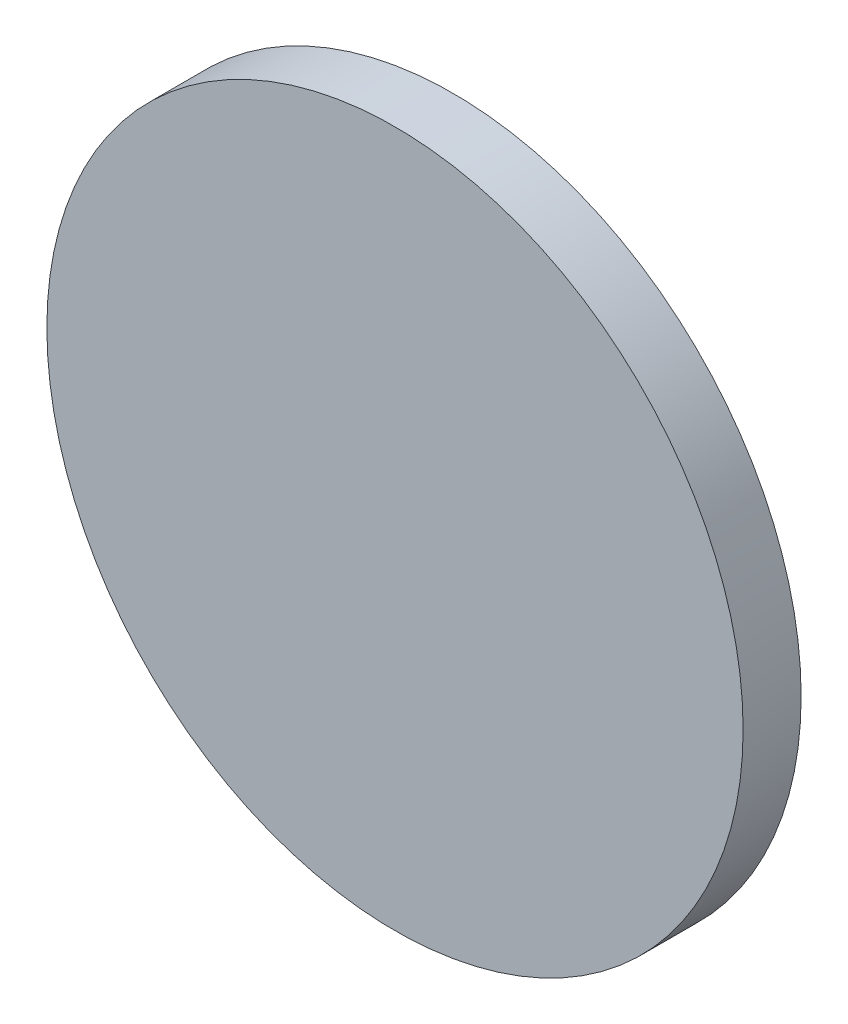
ISO-10303-21;
HEADER;
FILE_DESCRIPTION(('STEP AP214'),'2;1');
FILE_NAME('part.step','',(''),(''),'','','');
FILE_SCHEMA(('AUTOMOTIVE_DESIGN { 1 0 10303 214 1 1 1 1 }'));
ENDSEC;
DATA;
#1=APPLICATION_CONTEXT('core data for automotive mechanical design processes');
#2=APPLICATION_PROTOCOL_DEFINITION('international standard','automotive_design',2000,#1);
#3=PRODUCT_CONTEXT('',#1,'mechanical');
#4=PRODUCT('Part','Part','',(#3));
#5=PRODUCT_RELATED_PRODUCT_CATEGORY('part','',(#4));
#6=PRODUCT_DEFINITION_FORMATION('','',#4);
#7=PRODUCT_DEFINITION_CONTEXT('part definition',#1,'design');
#8=PRODUCT_DEFINITION('design','',#6,#7);
#9=PRODUCT_DEFINITION_SHAPE('','',#8);
#10=(LENGTH_UNIT() NAMED_UNIT(*) SI_UNIT(.MILLI.,.METRE.));
#11=(NAMED_UNIT(*) PLANE_ANGLE_UNIT() SI_UNIT($,.RADIAN.));
#12=(NAMED_UNIT(*) SI_UNIT($,.STERADIAN.) SOLID_ANGLE_UNIT());
#13=UNCERTAINTY_MEASURE_WITH_UNIT(LENGTH_MEASURE(1.E-05),#10,'distance_accuracy_value','');
#14=(GEOMETRIC_REPRESENTATION_CONTEXT(3) GLOBAL_UNCERTAINTY_ASSIGNED_CONTEXT((#13)) GLOBAL_UNIT_ASSIGNED_CONTEXT((#10,
#11,#12)) REPRESENTATION_CONTEXT('',''));
#15=CARTESIAN_POINT('',(0.,0.,0.));
#16=DIRECTION('',(0.,0.,1.));
#17=DIRECTION('',(1.,0.,0.));
#18=AXIS2_PLACEMENT_3D('',#15,#16,#17);
#19=CARTESIAN_POINT('',(0.,0.,12.7));
#20=DIRECTION('',(0.,0.,-1.));
#21=DIRECTION('',(-1.,0.,0.));
#22=AXIS2_PLACEMENT_3D('',#19,#20,#21);
#23=CYLINDRICAL_SURFACE('',#22,76.2);
#24=CARTESIAN_POINT('',(0.,0.,12.7));
#25=DIRECTION('',(0.,0.,1.));
#26=DIRECTION('',(1.,0.,0.));
#27=AXIS2_PLACEMENT_3D('',#24,#25,#26);
#28=CIRCLE('',#27,76.2);
#29=CARTESIAN_POINT('',(76.2,0.,12.7));
#30=VERTEX_POINT('',#29);
#31=EDGE_CURVE('E10',#30,#30,#28,.T.);
#32=ORIENTED_EDGE('',*,*,#31,.F.);
#33=EDGE_LOOP('',(#32));
#34=FACE_BOUND('',#33,.T.);
#35=CARTESIAN_POINT('',(0.,0.,0.));
#36=DIRECTION('',(0.,0.,1.));
#37=DIRECTION('',(1.,0.,0.));
#38=AXIS2_PLACEMENT_3D('',#35,#36,#37);
#39=CIRCLE('',#38,76.2);
#40=CARTESIAN_POINT('',(76.2,0.,0.));
#41=VERTEX_POINT('',#40);
#42=EDGE_CURVE('E40',#41,#41,#39,.T.);
#43=ORIENTED_EDGE('',*,*,#42,.T.);
#44=EDGE_LOOP('',(#43));
#45=FACE_BOUND('',#44,.T.);
#46=ADVANCED_FACE('F37',(#34,#45),#23,.T.);
#47=CARTESIAN_POINT('',(0.,0.,12.7));
#48=DIRECTION('',(0.,0.,1.));
#49=DIRECTION('',(1.,0.,0.));
#50=AXIS2_PLACEMENT_3D('',#47,#48,#49);
#51=PLANE('',#50);
#52=ORIENTED_EDGE('',*,*,#31,.T.);
#53=EDGE_LOOP('',(#52));
#54=FACE_BOUND('',#53,.T.);
#55=ADVANCED_FACE('F54',(#54),#51,.T.);
#56=CARTESIAN_POINT('',(0.,0.,0.));
#57=DIRECTION('',(0.,0.,1.));
#58=DIRECTION('',(1.,0.,0.));
#59=AXIS2_PLACEMENT_3D('',#56,#57,#58);
#60=PLANE('',#59);
#61=ORIENTED_EDGE('',*,*,#42,.F.);
#62=EDGE_LOOP('',(#61));
#63=FACE_BOUND('',#62,.T.);
#64=ADVANCED_FACE('F52',(#63),#60,.F.);
#65=CLOSED_SHELL('',(#46,#55,#64));
#66=MANIFOLD_SOLID_BREP('B2',#65);
#67=ADVANCED_BREP_SHAPE_REPRESENTATION('',(#18,#66),#14);
#68=SHAPE_DEFINITION_REPRESENTATION(#9,#67);
ENDSEC;
END-ISO-10303-21;
